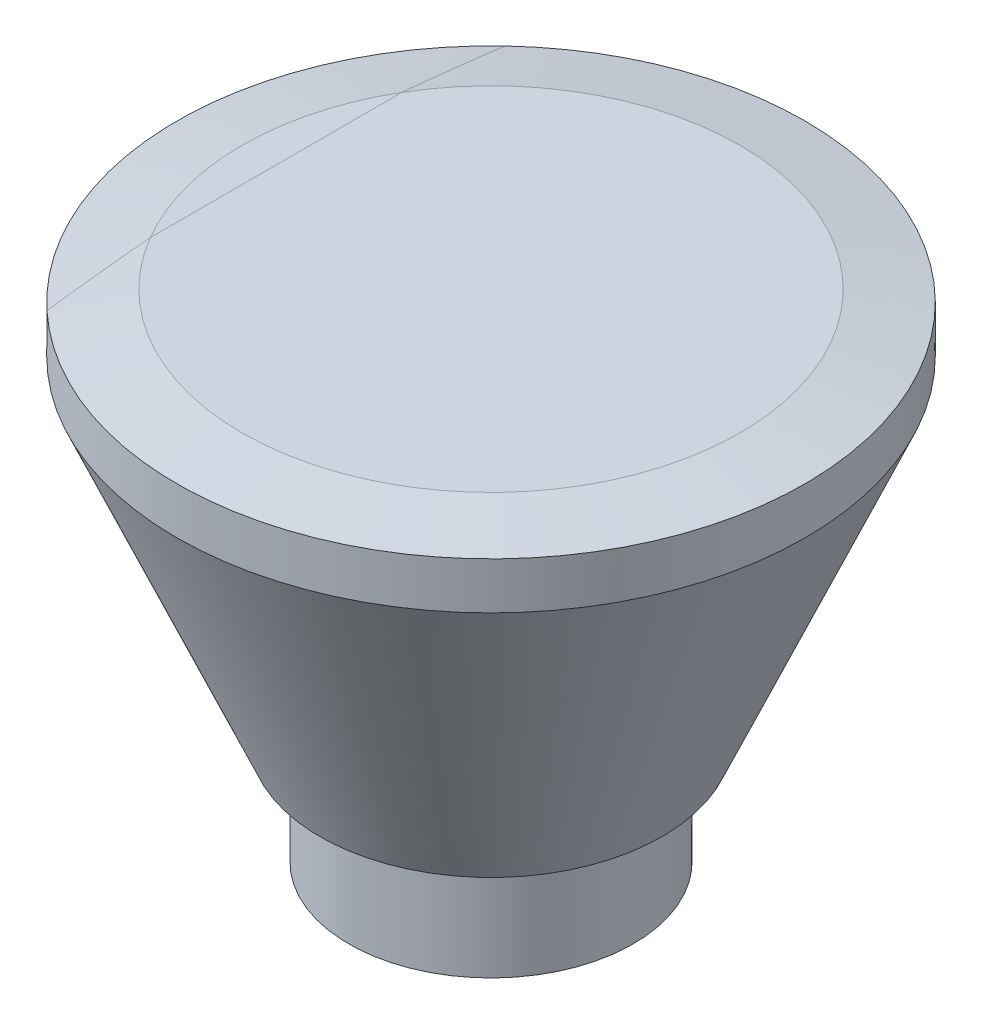
ISO-10303-21;
HEADER;
FILE_DESCRIPTION(('STEP AP214'),'2;1');
FILE_NAME('part.step','',(''),(''),'','','');
FILE_SCHEMA(('AUTOMOTIVE_DESIGN { 1 0 10303 214 1 1 1 1 }'));
ENDSEC;
DATA;
#1=APPLICATION_CONTEXT('core data for automotive mechanical design processes');
#2=APPLICATION_PROTOCOL_DEFINITION('international standard','automotive_design',2000,#1);
#3=PRODUCT_CONTEXT('',#1,'mechanical');
#4=PRODUCT('Part','Part','',(#3));
#5=PRODUCT_RELATED_PRODUCT_CATEGORY('part','',(#4));
#6=PRODUCT_DEFINITION_FORMATION('','',#4);
#7=PRODUCT_DEFINITION_CONTEXT('part definition',#1,'design');
#8=PRODUCT_DEFINITION('design','',#6,#7);
#9=PRODUCT_DEFINITION_SHAPE('','',#8);
#10=(LENGTH_UNIT() NAMED_UNIT(*) SI_UNIT(.MILLI.,.METRE.));
#11=(NAMED_UNIT(*) PLANE_ANGLE_UNIT() SI_UNIT($,.RADIAN.));
#12=(NAMED_UNIT(*) SI_UNIT($,.STERADIAN.) SOLID_ANGLE_UNIT());
#13=UNCERTAINTY_MEASURE_WITH_UNIT(LENGTH_MEASURE(1.E-05),#10,'distance_accuracy_value','');
#14=(GEOMETRIC_REPRESENTATION_CONTEXT(3) GLOBAL_UNCERTAINTY_ASSIGNED_CONTEXT((#13)) GLOBAL_UNIT_ASSIGNED_CONTEXT((#10,
#11,#12)) REPRESENTATION_CONTEXT('',''));
#15=CARTESIAN_POINT('',(0.,0.,0.));
#16=DIRECTION('',(0.,0.,1.));
#17=DIRECTION('',(1.,0.,0.));
#18=AXIS2_PLACEMENT_3D('',#15,#16,#17);
#19=CARTESIAN_POINT('',(0.,22.4817362650327,0.));
#20=DIRECTION('',(0.,-1.,0.));
#21=DIRECTION('',(0.,0.,-1.));
#22=AXIS2_PLACEMENT_3D('',#19,#20,#21);
#23=CONICAL_SURFACE('',#22,19.,1.39626340159547);
#24=CARTESIAN_POINT('',(0.,22.4817362650327,0.));
#25=DIRECTION('',(0.,-1.,0.));
#26=DIRECTION('',(0.,0.,-1.));
#27=AXIS2_PLACEMENT_3D('',#24,#25,#26);
#28=CIRCLE('',#27,19.);
#29=CARTESIAN_POINT('',(-13.,22.4817362650327,13.856406460551));
#30=VERTEX_POINT('',#29);
#31=CARTESIAN_POINT('',(-13.,22.4817362650327,-13.856406460551));
#32=VERTEX_POINT('',#31);
#33=EDGE_CURVE('E81',#30,#32,#28,.T.);
#34=ORIENTED_EDGE('',*,*,#33,.F.);
#35=CARTESIAN_POINT('',(-13.,19.9875390655756,30.4895161654745));
#36=CARTESIAN_POINT('',(-13.,20.0916347025143,29.8476905336172));
#37=CARTESIAN_POINT('',(-13.,20.1952520525996,29.2057869232764));
#38=CARTESIAN_POINT('',(-13.,20.401321330095,27.9217911718034));
#39=CARTESIAN_POINT('',(-13.,20.5037732547505,27.2796990302293));
#40=CARTESIAN_POINT('',(-13.,20.7073066351268,25.9952695608044));
#41=CARTESIAN_POINT('',(-13.,20.8083880328017,25.3529322237462));
#42=CARTESIAN_POINT('',(-13.,21.0089012650827,24.0680001913044));
#43=CARTESIAN_POINT('',(-13.,21.1083331004593,23.4254054960411));
#44=CARTESIAN_POINT('',(-13.,21.3058215589137,22.1358860409191));
#45=CARTESIAN_POINT('',(-13.,21.4038656724171,21.4889593626281));
#46=CARTESIAN_POINT('',(-13.,21.5974936069889,20.1947380838925));
#47=CARTESIAN_POINT('',(-13.,21.6930774310512,19.5474434838964));
#48=CARTESIAN_POINT('',(-13.,21.8812176782551,18.2524125259976));
#49=CARTESIAN_POINT('',(-13.,21.9737740971054,17.60467616747));
#50=CARTESIAN_POINT('',(-13.,22.1551301284059,16.3086758796796));
#51=CARTESIAN_POINT('',(-13.,22.2439297396296,15.6604119502447));
#52=CARTESIAN_POINT('',(-13.,22.415544509107,14.3729191267315));
#53=CARTESIAN_POINT('',(-13.,22.498429119683,13.7336995266951));
#54=CARTESIAN_POINT('',(-13.,22.6584918602058,12.4545416986967));
#55=CARTESIAN_POINT('',(-13.,22.7356699840901,11.8146034699719));
#56=CARTESIAN_POINT('',(-13.,22.8828775257037,10.5338495345427));
#57=CARTESIAN_POINT('',(-13.,22.9529063941772,9.89303376424635));
#58=CARTESIAN_POINT('',(-13.,23.0840330592408,8.61047919203078));
#59=CARTESIAN_POINT('',(-13.,23.1451308435742,7.96874038884602));
#60=CARTESIAN_POINT('',(-13.,23.2561400198527,6.68643607556363));
#61=CARTESIAN_POINT('',(-13.,23.3060879746129,6.04587377159681));
#62=CARTESIAN_POINT('',(-13.,23.3928652024007,4.76386474126162));
#63=CARTESIAN_POINT('',(-13.,23.4296948485199,4.12241804056691));
#64=CARTESIAN_POINT('',(-13.,23.4882185137486,2.83898342444467));
#65=CARTESIAN_POINT('',(-13.,23.5099163632756,2.19699568720111));
#66=CARTESIAN_POINT('',(-13.,23.5368061893442,0.912673419967467));
#67=CARTESIAN_POINT('',(-13.,23.5419983339154,0.270338893574322));
#68=CARTESIAN_POINT('',(-13.,23.5355988101753,-0.998977350105747));
#69=CARTESIAN_POINT('',(-13.,23.5244031296896,-1.62596110371077));
#70=CARTESIAN_POINT('',(-13.,23.4866710029589,-2.87945760004487));
#71=CARTESIAN_POINT('',(-13.,23.4601344086011,-3.50597033816794));
#72=CARTESIAN_POINT('',(-13.,23.3597820193976,-5.38469318401634));
#73=CARTESIAN_POINT('',(-13.,23.2652261946311,-6.63580943363815));
#74=CARTESIAN_POINT('',(-13.,23.0937088417883,-8.51164386407171));
#75=CARTESIAN_POINT('',(-13.,23.0314606473325,-9.13782352486299));
#76=CARTESIAN_POINT('',(-13.,22.898934935354,-10.3893424884137));
#77=CARTESIAN_POINT('',(-13.,22.8286574285559,-11.0146817922944));
#78=CARTESIAN_POINT('',(-13.,22.6816515334218,-12.264532290718));
#79=CARTESIAN_POINT('',(-13.,22.6049237524224,-12.8890435576143));
#80=CARTESIAN_POINT('',(-13.,22.4462915253893,-14.137405838054));
#81=CARTESIAN_POINT('',(-13.,22.3643870838686,-14.7612568521726));
#82=CARTESIAN_POINT('',(-13.,22.1951780100342,-16.017605324806));
#83=CARTESIAN_POINT('',(-13.,22.1078114897659,-16.6500944133672));
#84=CARTESIAN_POINT('',(-13.,21.9296293115916,-17.9145851118954));
#85=CARTESIAN_POINT('',(-13.,21.8388136545864,-18.5465867219897));
#86=CARTESIAN_POINT('',(-13.,21.654383858945,-19.8101874123));
#87=CARTESIAN_POINT('',(-13.,21.5607696908123,-20.4417864882017));
#88=CARTESIAN_POINT('',(-13.,21.3712540200524,-21.704641526758));
#89=CARTESIAN_POINT('',(-13.,21.275352514973,-22.3358974890441));
#90=CARTESIAN_POINT('',(-13.,21.0822398246866,-23.5943666770609));
#91=CARTESIAN_POINT('',(-13.,20.98503981913,-24.2215816204942));
#92=CARTESIAN_POINT('',(-13.,20.7890885467635,-25.4757691975206));
#93=CARTESIAN_POINT('',(-13.,20.6903372792847,-26.1027418310091));
#94=CARTESIAN_POINT('',(-13.,20.4915404131727,-27.3564498902704));
#95=CARTESIAN_POINT('',(-13.,20.3914948787687,-27.9831853262378));
#96=CARTESIAN_POINT('',(-13.,20.1902980540047,-29.2364773597437));
#97=CARTESIAN_POINT('',(-13.,20.0891467660267,-29.8630339576643));
#98=CARTESIAN_POINT('',(-13.,19.9875390655756,-30.4895161654745));
#99=B_SPLINE_CURVE_WITH_KNOTS('',3,(#35,#36,#37,#38,#39,#40,#41,#42,#43,#44,#45,#46,#47,#48,#49,
#50,#51,#52,#53,#54,#55,#56,#57,#58,#59,#60,#61,#62,#63,#64,#65,#66,#67,#68,#69,#70,#71,#72,#73,
#74,#75,#76,#77,#78,#79,#80,#81,#82,#83,#84,#85,#86,#87,#88,#89,#90,#91,#92,#93,#94,#95,#96,#97,
#98),.UNSPECIFIED.,.F.,.F.,(4,2,2,2,2,2,2,2,2,2,2,2,2,2,2,2,2,2,2,2,2,2,2,2,2,2,2,2,2,2,2,4),
(0.,1.95063733751736,3.90127928453466,5.85200359067993,7.80272698570068,9.76566507352978,
11.7286007726886,13.6915392542315,15.6544783765624,17.5881706616603,19.5218650010976,
21.4557077888106,23.3895532304317,25.3169608260723,27.2443136008446,29.1711783140515,
31.0980234115189,32.9790708706674,34.8601364911848,38.6231024232312,40.5108799595392,
42.3986549744107,44.2862524412547,46.1738482624778,48.0893205989275,50.0047924351898,
51.9202844677935,53.8357785541837,55.7398817816886,57.6439858302507,59.5479957455857,
61.4520015601429),.UNSPECIFIED.);
#100=CARTESIAN_POINT('',(-13.,23.1763289757004,7.60439100181149));
#101=VERTEX_POINT('',#100);
#102=EDGE_CURVE('E11',#30,#101,#99,.T.);
#103=ORIENTED_EDGE('',*,*,#102,.T.);
#104=CARTESIAN_POINT('',(0.,23.1763289757004,0.));
#105=DIRECTION('',(0.,-1.,0.));
#106=DIRECTION('',(0.,0.,-1.));
#107=AXIS2_PLACEMENT_3D('',#104,#105,#106);
#108=CIRCLE('',#107,15.0607689879512);
#109=CARTESIAN_POINT('',(-13.,23.1763289757004,-7.60439100181149));
#110=VERTEX_POINT('',#109);
#111=EDGE_CURVE('E79',#101,#110,#108,.T.);
#112=ORIENTED_EDGE('',*,*,#111,.T.);
#113=EDGE_CURVE('E61',#110,#32,#99,.T.);
#114=ORIENTED_EDGE('',*,*,#113,.T.);
#115=EDGE_LOOP('',(#34,#103,#112,#114));
#116=FACE_BOUND('',#115,.T.);
#117=ADVANCED_FACE('F51',(#116),#23,.T.);
#118=CARTESIAN_POINT('',(0.,23.1763289757004,0.));
#119=DIRECTION('',(0.,-1.,0.));
#120=DIRECTION('',(0.,0.,-1.));
#121=AXIS2_PLACEMENT_3D('',#118,#119,#120);
#122=PLANE('',#121);
#123=DIRECTION('',(0.,0.,1.));
#124=VECTOR('',#123,1.);
#125=CARTESIAN_POINT('',(-13.,23.1763289757004,0.));
#126=LINE('',#125,#124);
#127=EDGE_CURVE('E55',#110,#101,#126,.T.);
#128=ORIENTED_EDGE('',*,*,#127,.F.);
#129=ORIENTED_EDGE('',*,*,#111,.F.);
#130=EDGE_LOOP('',(#128,#129));
#131=FACE_BOUND('',#130,.T.);
#132=ADVANCED_FACE('F93',(#131),#122,.F.);
#133=CARTESIAN_POINT('',(0.,-1.57367102429958,0.));
#134=DIRECTION('',(0.,-1.,0.));
#135=DIRECTION('',(0.,0.,-1.));
#136=AXIS2_PLACEMENT_3D('',#133,#134,#135);
#137=CYLINDRICAL_SURFACE('',#136,19.);
#138=ORIENTED_EDGE('',*,*,#33,.T.);
#139=EDGE_CURVE('E250',#32,#30,#28,.T.);
#140=ORIENTED_EDGE('',*,*,#139,.T.);
#141=EDGE_LOOP('',(#138,#140));
#142=FACE_BOUND('',#141,.T.);
#143=CARTESIAN_POINT('',(0.,19.6513289757004,0.));
#144=DIRECTION('',(0.,-1.,0.));
#145=DIRECTION('',(0.,0.,-1.));
#146=AXIS2_PLACEMENT_3D('',#143,#144,#145);
#147=CIRCLE('',#146,19.);
#148=CARTESIAN_POINT('',(0.,19.6513289757004,-19.));
#149=VERTEX_POINT('',#148);
#150=EDGE_CURVE('E89',#149,#149,#147,.T.);
#151=ORIENTED_EDGE('',*,*,#150,.F.);
#152=EDGE_LOOP('',(#151));
#153=FACE_BOUND('',#152,.T.);
#154=ADVANCED_FACE('F126',(#142,#153),#137,.T.);
#155=CARTESIAN_POINT('',(0.,19.6513289757004,0.));
#156=DIRECTION('',(0.,1.,0.));
#157=DIRECTION('',(0.,0.,1.));
#158=AXIS2_PLACEMENT_3D('',#155,#156,#157);
#159=CONICAL_SURFACE('',#158,19.,0.408661938833639);
#160=CARTESIAN_POINT('',(0.,-0.32367102429958,0.));
#161=DIRECTION('',(0.,-1.,0.));
#162=DIRECTION('',(0.,0.,-1.));
#163=AXIS2_PLACEMENT_3D('',#160,#161,#162);
#164=CIRCLE('',#163,10.35);
#165=CARTESIAN_POINT('',(0.,-0.32367102429958,-10.35));
#166=VERTEX_POINT('',#165);
#167=EDGE_CURVE('E113',#166,#166,#164,.T.);
#168=ORIENTED_EDGE('',*,*,#167,.F.);
#169=EDGE_LOOP('',(#168));
#170=FACE_BOUND('',#169,.T.);
#171=ORIENTED_EDGE('',*,*,#150,.T.);
#172=EDGE_LOOP('',(#171));
#173=FACE_BOUND('',#172,.T.);
#174=ADVANCED_FACE('F129',(#170,#173),#159,.T.);
#175=CARTESIAN_POINT('',(0.,-0.32367102429958,0.));
#176=DIRECTION('',(0.,1.,0.));
#177=DIRECTION('',(0.,0.,1.));
#178=AXIS2_PLACEMENT_3D('',#175,#176,#177);
#179=PLANE('',#178);
#180=CARTESIAN_POINT('',(0.,-0.32367102429958,0.));
#181=DIRECTION('',(0.,-1.,0.));
#182=DIRECTION('',(0.,0.,-1.));
#183=AXIS2_PLACEMENT_3D('',#180,#181,#182);
#184=CIRCLE('',#183,8.6);
#185=CARTESIAN_POINT('',(0.,-0.32367102429958,-8.6));
#186=VERTEX_POINT('',#185);
#187=EDGE_CURVE('E109',#186,#186,#184,.T.);
#188=ORIENTED_EDGE('',*,*,#187,.F.);
#189=EDGE_LOOP('',(#188));
#190=FACE_BOUND('',#189,.T.);
#191=ORIENTED_EDGE('',*,*,#167,.T.);
#192=EDGE_LOOP('',(#191));
#193=FACE_BOUND('',#192,.T.);
#194=ADVANCED_FACE('F133',(#190,#193),#179,.F.);
#195=CARTESIAN_POINT('',(0.,-1.57367102429958,0.));
#196=DIRECTION('',(0.,-1.,0.));
#197=DIRECTION('',(0.,0.,-1.));
#198=AXIS2_PLACEMENT_3D('',#195,#196,#197);
#199=CYLINDRICAL_SURFACE('',#198,8.6);
#200=CARTESIAN_POINT('',(0.,-6.82367102429958,0.));
#201=DIRECTION('',(0.,-1.,0.));
#202=DIRECTION('',(0.,0.,-1.));
#203=AXIS2_PLACEMENT_3D('',#200,#201,#202);
#204=CIRCLE('',#203,8.6);
#205=CARTESIAN_POINT('',(0.,-6.82367102429958,-8.6));
#206=VERTEX_POINT('',#205);
#207=EDGE_CURVE('E105',#206,#206,#204,.T.);
#208=ORIENTED_EDGE('',*,*,#207,.F.);
#209=EDGE_LOOP('',(#208));
#210=FACE_BOUND('',#209,.T.);
#211=ORIENTED_EDGE('',*,*,#187,.T.);
#212=EDGE_LOOP('',(#211));
#213=FACE_BOUND('',#212,.T.);
#214=ADVANCED_FACE('F137',(#210,#213),#199,.T.);
#215=CARTESIAN_POINT('',(0.,-6.82367102429958,0.));
#216=DIRECTION('',(0.,1.,0.));
#217=DIRECTION('',(0.,0.,1.));
#218=AXIS2_PLACEMENT_3D('',#215,#216,#217);
#219=PLANE('',#218);
#220=CARTESIAN_POINT('',(0.,-6.82367102429958,0.));
#221=DIRECTION('',(0.,-1.,0.));
#222=DIRECTION('',(0.,0.,-1.));
#223=AXIS2_PLACEMENT_3D('',#220,#221,#222);
#224=CIRCLE('',#223,5.6);
#225=CARTESIAN_POINT('',(0.,-6.82367102429958,-5.6));
#226=VERTEX_POINT('',#225);
#227=EDGE_CURVE('E98',#226,#226,#224,.T.);
#228=ORIENTED_EDGE('',*,*,#227,.F.);
#229=EDGE_LOOP('',(#228));
#230=FACE_BOUND('',#229,.T.);
#231=ORIENTED_EDGE('',*,*,#207,.T.);
#232=EDGE_LOOP('',(#231));
#233=FACE_BOUND('',#232,.T.);
#234=ADVANCED_FACE('F141',(#230,#233),#219,.F.);
#235=CARTESIAN_POINT('',(0.,-1.57367102429958,0.));
#236=DIRECTION('',(0.,-1.,0.));
#237=DIRECTION('',(0.,0.,-1.));
#238=AXIS2_PLACEMENT_3D('',#235,#236,#237);
#239=CYLINDRICAL_SURFACE('',#238,5.6);
#240=CARTESIAN_POINT('',(0.,3.42632897570042,0.));
#241=DIRECTION('',(0.,-1.,0.));
#242=DIRECTION('',(0.,0.,-1.));
#243=AXIS2_PLACEMENT_3D('',#240,#241,#242);
#244=CIRCLE('',#243,5.6);
#245=CARTESIAN_POINT('',(0.,3.42632897570042,-5.6));
#246=VERTEX_POINT('',#245);
#247=EDGE_CURVE('E95',#246,#246,#244,.T.);
#248=ORIENTED_EDGE('',*,*,#247,.F.);
#249=EDGE_LOOP('',(#248));
#250=FACE_BOUND('',#249,.T.);
#251=ORIENTED_EDGE('',*,*,#227,.T.);
#252=EDGE_LOOP('',(#251));
#253=FACE_BOUND('',#252,.T.);
#254=ADVANCED_FACE('F145',(#250,#253),#239,.F.);
#255=CARTESIAN_POINT('',(0.,3.42632897570042,0.));
#256=DIRECTION('',(0.,1.,0.));
#257=DIRECTION('',(0.,0.,1.));
#258=AXIS2_PLACEMENT_3D('',#255,#256,#257);
#259=PLANE('',#258);
#260=ORIENTED_EDGE('',*,*,#247,.T.);
#261=EDGE_LOOP('',(#260));
#262=FACE_BOUND('',#261,.T.);
#263=ADVANCED_FACE('F149',(#262),#259,.F.);
#264=EDGE_CURVE('E86',#110,#101,#108,.T.);
#265=ORIENTED_EDGE('',*,*,#264,.F.);
#266=ORIENTED_EDGE('',*,*,#127,.T.);
#267=EDGE_LOOP('',(#265,#266));
#268=FACE_BOUND('',#267,.T.);
#269=ADVANCED_FACE('F85',(#268),#122,.F.);
#270=ORIENTED_EDGE('',*,*,#102,.F.);
#271=ORIENTED_EDGE('',*,*,#139,.F.);
#272=ORIENTED_EDGE('',*,*,#113,.F.);
#273=ORIENTED_EDGE('',*,*,#264,.T.);
#274=EDGE_LOOP('',(#270,#271,#272,#273));
#275=FACE_BOUND('',#274,.T.);
#276=ADVANCED_FACE('F90',(#275),#23,.T.);
#277=CLOSED_SHELL('',(#117,#132,#154,#174,#194,#214,#234,#254,#263,#269,#276));
#278=MANIFOLD_SOLID_BREP('B2',#277);
#279=ADVANCED_BREP_SHAPE_REPRESENTATION('',(#18,#278),#14);
#280=SHAPE_DEFINITION_REPRESENTATION(#9,#279);
ENDSEC;
END-ISO-10303-21;
